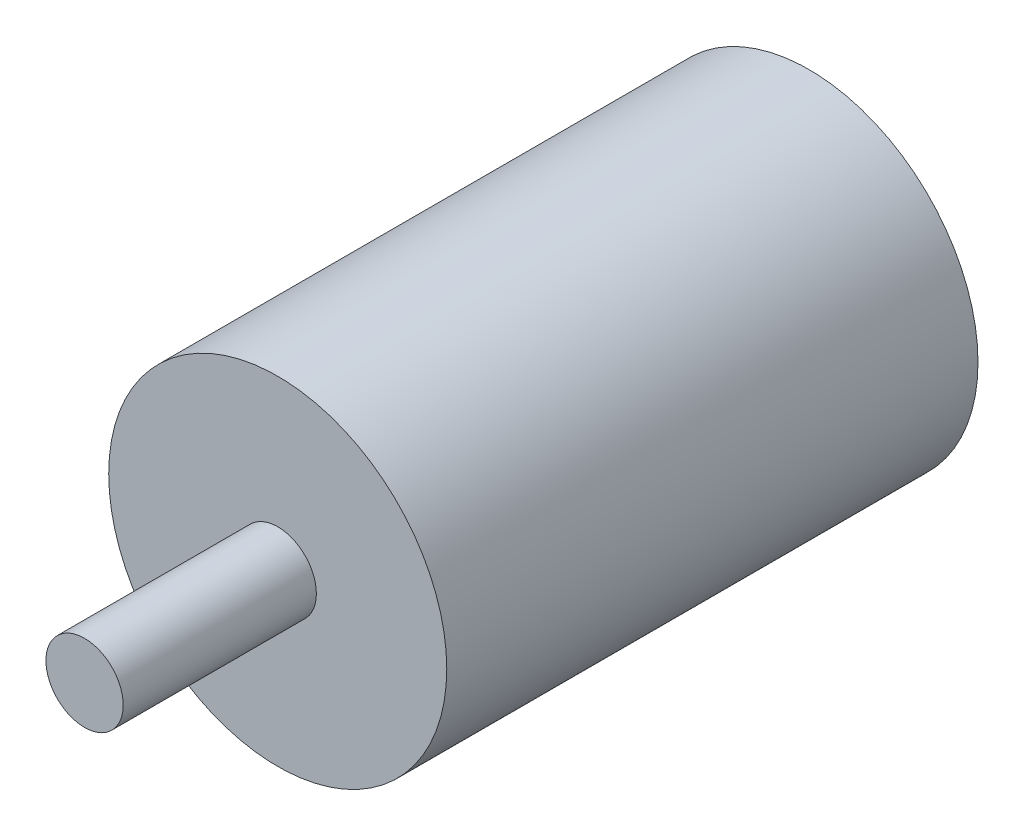
ISO-10303-21;
HEADER;
FILE_DESCRIPTION(('STEP AP214'),'2;1');
FILE_NAME('part.step','',(''),(''),'','','');
FILE_SCHEMA(('AUTOMOTIVE_DESIGN { 1 0 10303 214 1 1 1 1 }'));
ENDSEC;
DATA;
#1=APPLICATION_CONTEXT('core data for automotive mechanical design processes');
#2=APPLICATION_PROTOCOL_DEFINITION('international standard','automotive_design',2000,#1);
#3=PRODUCT_CONTEXT('',#1,'mechanical');
#4=PRODUCT('Part','Part','',(#3));
#5=PRODUCT_RELATED_PRODUCT_CATEGORY('part','',(#4));
#6=PRODUCT_DEFINITION_FORMATION('','',#4);
#7=PRODUCT_DEFINITION_CONTEXT('part definition',#1,'design');
#8=PRODUCT_DEFINITION('design','',#6,#7);
#9=PRODUCT_DEFINITION_SHAPE('','',#8);
#10=(LENGTH_UNIT() NAMED_UNIT(*) SI_UNIT(.MILLI.,.METRE.));
#11=(NAMED_UNIT(*) PLANE_ANGLE_UNIT() SI_UNIT($,.RADIAN.));
#12=(NAMED_UNIT(*) SI_UNIT($,.STERADIAN.) SOLID_ANGLE_UNIT());
#13=UNCERTAINTY_MEASURE_WITH_UNIT(LENGTH_MEASURE(1.E-05),#10,'distance_accuracy_value','');
#14=(GEOMETRIC_REPRESENTATION_CONTEXT(3) GLOBAL_UNCERTAINTY_ASSIGNED_CONTEXT((#13)) GLOBAL_UNIT_ASSIGNED_CONTEXT((#10,
#11,#12)) REPRESENTATION_CONTEXT('',''));
#15=CARTESIAN_POINT('',(0.,0.,0.));
#16=DIRECTION('',(0.,0.,1.));
#17=DIRECTION('',(1.,0.,0.));
#18=AXIS2_PLACEMENT_3D('',#15,#16,#17);
#19=CARTESIAN_POINT('',(0.,0.,55.));
#20=DIRECTION('',(0.,0.,1.));
#21=DIRECTION('',(1.,0.,0.));
#22=AXIS2_PLACEMENT_3D('',#19,#20,#21);
#23=PLANE('',#22);
#24=CARTESIAN_POINT('',(0.,0.,55.));
#25=DIRECTION('',(0.,0.,1.));
#26=DIRECTION('',(1.,0.,0.));
#27=AXIS2_PLACEMENT_3D('',#24,#25,#26);
#28=CIRCLE('',#27,17.5);
#29=CARTESIAN_POINT('',(17.5,0.,55.));
#30=VERTEX_POINT('',#29);
#31=EDGE_CURVE('E10',#30,#30,#28,.T.);
#32=ORIENTED_EDGE('',*,*,#31,.T.);
#33=EDGE_LOOP('',(#32));
#34=FACE_BOUND('',#33,.T.);
#35=CARTESIAN_POINT('',(0.,0.,55.));
#36=DIRECTION('',(0.,0.,1.));
#37=DIRECTION('',(1.,0.,0.));
#38=AXIS2_PLACEMENT_3D('',#35,#36,#37);
#39=CIRCLE('',#38,4.);
#40=CARTESIAN_POINT('',(4.,0.,55.));
#41=VERTEX_POINT('',#40);
#42=EDGE_CURVE('E43',#41,#41,#39,.T.);
#43=ORIENTED_EDGE('',*,*,#42,.F.);
#44=EDGE_LOOP('',(#43));
#45=FACE_BOUND('',#44,.T.);
#46=ADVANCED_FACE('F30',(#34,#45),#23,.T.);
#47=CARTESIAN_POINT('',(0.,0.,55.));
#48=DIRECTION('',(0.,0.,-1.));
#49=DIRECTION('',(-1.,0.,0.));
#50=AXIS2_PLACEMENT_3D('',#47,#48,#49);
#51=CYLINDRICAL_SURFACE('',#50,17.5);
#52=ORIENTED_EDGE('',*,*,#31,.F.);
#53=EDGE_LOOP('',(#52));
#54=FACE_BOUND('',#53,.T.);
#55=CARTESIAN_POINT('',(0.,0.,0.));
#56=DIRECTION('',(0.,0.,1.));
#57=DIRECTION('',(1.,0.,0.));
#58=AXIS2_PLACEMENT_3D('',#55,#56,#57);
#59=CIRCLE('',#58,17.5);
#60=CARTESIAN_POINT('',(17.5,0.,0.));
#61=VERTEX_POINT('',#60);
#62=EDGE_CURVE('E34',#61,#61,#59,.T.);
#63=ORIENTED_EDGE('',*,*,#62,.T.);
#64=EDGE_LOOP('',(#63));
#65=FACE_BOUND('',#64,.T.);
#66=ADVANCED_FACE('F32',(#54,#65),#51,.T.);
#67=CARTESIAN_POINT('',(0.,0.,0.));
#68=DIRECTION('',(0.,0.,1.));
#69=DIRECTION('',(1.,0.,0.));
#70=AXIS2_PLACEMENT_3D('',#67,#68,#69);
#71=PLANE('',#70);
#72=ORIENTED_EDGE('',*,*,#62,.F.);
#73=EDGE_LOOP('',(#72));
#74=FACE_BOUND('',#73,.T.);
#75=ADVANCED_FACE('F54',(#74),#71,.F.);
#76=CARTESIAN_POINT('',(0.,0.,75.));
#77=DIRECTION('',(0.,0.,-1.));
#78=DIRECTION('',(-1.,0.,0.));
#79=AXIS2_PLACEMENT_3D('',#76,#77,#78);
#80=CYLINDRICAL_SURFACE('',#79,4.);
#81=CARTESIAN_POINT('',(0.,0.,75.));
#82=DIRECTION('',(0.,0.,1.));
#83=DIRECTION('',(1.,0.,0.));
#84=AXIS2_PLACEMENT_3D('',#81,#82,#83);
#85=CIRCLE('',#84,4.);
#86=CARTESIAN_POINT('',(4.,0.,75.));
#87=VERTEX_POINT('',#86);
#88=EDGE_CURVE('E41',#87,#87,#85,.T.);
#89=ORIENTED_EDGE('',*,*,#88,.F.);
#90=EDGE_LOOP('',(#89));
#91=FACE_BOUND('',#90,.T.);
#92=ORIENTED_EDGE('',*,*,#42,.T.);
#93=EDGE_LOOP('',(#92));
#94=FACE_BOUND('',#93,.T.);
#95=ADVANCED_FACE('F51',(#91,#94),#80,.T.);
#96=CARTESIAN_POINT('',(0.,0.,75.));
#97=DIRECTION('',(0.,0.,1.));
#98=DIRECTION('',(1.,0.,0.));
#99=AXIS2_PLACEMENT_3D('',#96,#97,#98);
#100=PLANE('',#99);
#101=ORIENTED_EDGE('',*,*,#88,.T.);
#102=EDGE_LOOP('',(#101));
#103=FACE_BOUND('',#102,.T.);
#104=ADVANCED_FACE('F49',(#103),#100,.T.);
#105=CLOSED_SHELL('',(#46,#66,#75,#95,#104));
#106=MANIFOLD_SOLID_BREP('B2',#105);
#107=ADVANCED_BREP_SHAPE_REPRESENTATION('',(#18,#106),#14);
#108=SHAPE_DEFINITION_REPRESENTATION(#9,#107);
ENDSEC;
END-ISO-10303-21;
